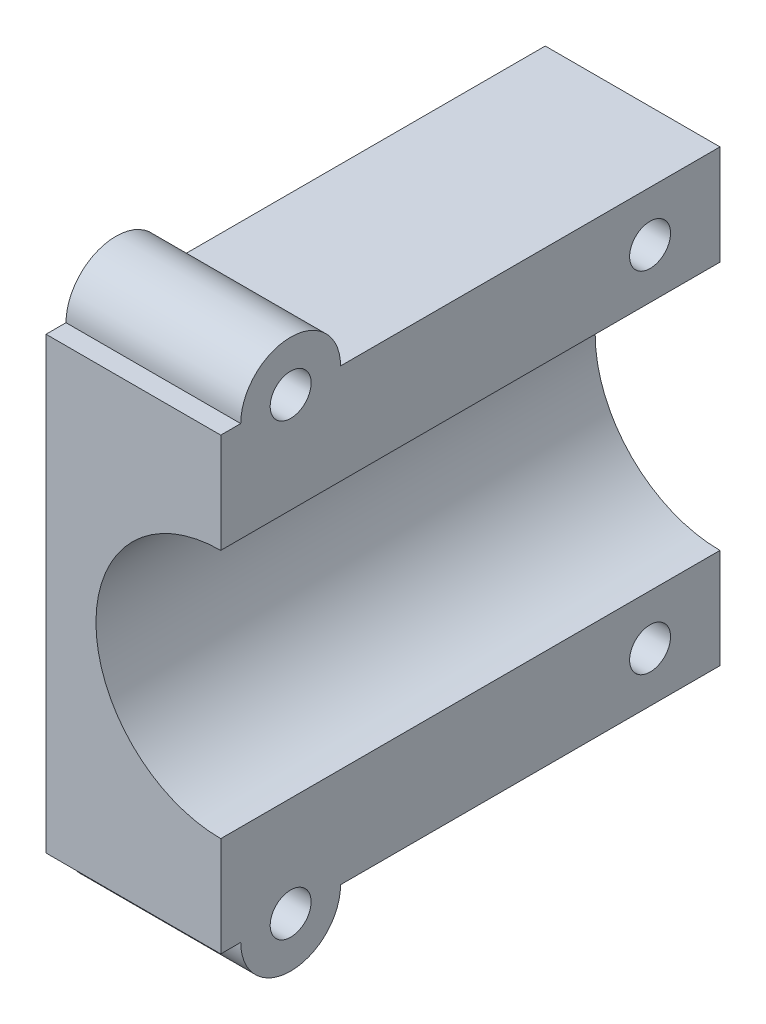
ISO-10303-21;
HEADER;
FILE_DESCRIPTION(('STEP AP214'),'2;1');
FILE_NAME('part.step','',(''),(''),'','','');
FILE_SCHEMA(('AUTOMOTIVE_DESIGN { 1 0 10303 214 1 1 1 1 }'));
ENDSEC;
DATA;
#1=APPLICATION_CONTEXT('core data for automotive mechanical design processes');
#2=APPLICATION_PROTOCOL_DEFINITION('international standard','automotive_design',2000,#1);
#3=PRODUCT_CONTEXT('',#1,'mechanical');
#4=PRODUCT('Part','Part','',(#3));
#5=PRODUCT_RELATED_PRODUCT_CATEGORY('part','',(#4));
#6=PRODUCT_DEFINITION_FORMATION('','',#4);
#7=PRODUCT_DEFINITION_CONTEXT('part definition',#1,'design');
#8=PRODUCT_DEFINITION('design','',#6,#7);
#9=PRODUCT_DEFINITION_SHAPE('','',#8);
#10=(LENGTH_UNIT() NAMED_UNIT(*) SI_UNIT(.MILLI.,.METRE.));
#11=(NAMED_UNIT(*) PLANE_ANGLE_UNIT() SI_UNIT($,.RADIAN.));
#12=(NAMED_UNIT(*) SI_UNIT($,.STERADIAN.) SOLID_ANGLE_UNIT());
#13=UNCERTAINTY_MEASURE_WITH_UNIT(LENGTH_MEASURE(1.E-05),#10,'distance_accuracy_value','');
#14=(GEOMETRIC_REPRESENTATION_CONTEXT(3) GLOBAL_UNCERTAINTY_ASSIGNED_CONTEXT((#13)) GLOBAL_UNIT_ASSIGNED_CONTEXT((#10,
#11,#12)) REPRESENTATION_CONTEXT('',''));
#15=CARTESIAN_POINT('',(0.,0.,0.));
#16=DIRECTION('',(0.,0.,1.));
#17=DIRECTION('',(1.,0.,0.));
#18=AXIS2_PLACEMENT_3D('',#15,#16,#17);
#19=CARTESIAN_POINT('',(23.2982756057297,40.,-18.));
#20=DIRECTION('',(-1.,0.,0.));
#21=DIRECTION('',(0.,0.,1.));
#22=AXIS2_PLACEMENT_3D('',#19,#20,#21);
#23=CYLINDRICAL_SURFACE('',#22,2.05);
#24=CARTESIAN_POINT('',(-17.5,40.,-18.));
#25=DIRECTION('',(1.,0.,0.));
#26=DIRECTION('',(0.,0.,1.));
#27=AXIS2_PLACEMENT_3D('',#24,#25,#26);
#28=CIRCLE('',#27,2.05);
#29=CARTESIAN_POINT('',(-17.5,40.,-15.95));
#30=VERTEX_POINT('',#29);
#31=EDGE_CURVE('E344',#30,#30,#28,.T.);
#32=ORIENTED_EDGE('',*,*,#31,.F.);
#33=EDGE_LOOP('',(#32));
#34=FACE_BOUND('',#33,.T.);
#35=CARTESIAN_POINT('',(-10.65,40.,-18.));
#36=DIRECTION('',(1.,0.,0.));
#37=DIRECTION('',(0.,0.,-1.));
#38=AXIS2_PLACEMENT_3D('',#35,#36,#37);
#39=CIRCLE('',#38,2.05);
#40=CARTESIAN_POINT('',(-10.65,40.,-20.05));
#41=VERTEX_POINT('',#40);
#42=EDGE_CURVE('E39',#41,#41,#39,.T.);
#43=ORIENTED_EDGE('',*,*,#42,.T.);
#44=EDGE_LOOP('',(#43));
#45=FACE_BOUND('',#44,.T.);
#46=ADVANCED_FACE('F35',(#34,#45),#23,.F.);
#47=CARTESIAN_POINT('',(5.79827560572969,0.,18.));
#48=DIRECTION('',(-1.,0.,0.));
#49=DIRECTION('',(0.,-1.,0.));
#50=AXIS2_PLACEMENT_3D('',#47,#48,#49);
#51=CYLINDRICAL_SURFACE('',#50,2.05);
#52=CARTESIAN_POINT('',(-17.5,0.,18.));
#53=DIRECTION('',(-1.,0.,0.));
#54=DIRECTION('',(0.,-1.,0.));
#55=AXIS2_PLACEMENT_3D('',#52,#53,#54);
#56=CIRCLE('',#55,2.05);
#57=CARTESIAN_POINT('',(-17.5,-2.05,18.));
#58=VERTEX_POINT('',#57);
#59=EDGE_CURVE('E305',#58,#58,#56,.T.);
#60=ORIENTED_EDGE('',*,*,#59,.T.);
#61=EDGE_LOOP('',(#60));
#62=FACE_BOUND('',#61,.T.);
#63=CARTESIAN_POINT('',(-10.65,0.,18.));
#64=DIRECTION('',(1.,0.,0.));
#65=DIRECTION('',(0.,0.,-1.));
#66=AXIS2_PLACEMENT_3D('',#63,#64,#65);
#67=CIRCLE('',#66,2.05);
#68=CARTESIAN_POINT('',(-10.65,0.,15.95));
#69=VERTEX_POINT('',#68);
#70=EDGE_CURVE('E381',#69,#69,#67,.F.);
#71=ORIENTED_EDGE('',*,*,#70,.F.);
#72=EDGE_LOOP('',(#71));
#73=FACE_BOUND('',#72,.T.);
#74=ADVANCED_FACE('F402',(#62,#73),#51,.F.);
#75=CARTESIAN_POINT('',(-17.5,45.,25.));
#76=DIRECTION('',(0.,1.,0.));
#77=DIRECTION('',(0.,0.,1.));
#78=AXIS2_PLACEMENT_3D('',#75,#76,#77);
#79=PLANE('',#78);
#80=DIRECTION('',(0.,0.,-1.));
#81=VECTOR('',#80,1.);
#82=CARTESIAN_POINT('',(-17.5,45.,25.));
#83=LINE('',#82,#81);
#84=CARTESIAN_POINT('',(-17.5,45.,13.));
#85=VERTEX_POINT('',#84);
#86=CARTESIAN_POINT('',(-17.5,45.,-25.));
#87=VERTEX_POINT('',#86);
#88=EDGE_CURVE('E351',#85,#87,#83,.T.);
#89=ORIENTED_EDGE('',*,*,#88,.F.);
#90=DIRECTION('',(-1.,0.,0.));
#91=VECTOR('',#90,1.);
#92=CARTESIAN_POINT('',(0.,45.,13.));
#93=LINE('',#92,#91);
#94=CARTESIAN_POINT('',(0.,45.,13.));
#95=VERTEX_POINT('',#94);
#96=EDGE_CURVE('E302',#95,#85,#93,.T.);
#97=ORIENTED_EDGE('',*,*,#96,.F.);
#98=DIRECTION('',(0.,0.,1.));
#99=VECTOR('',#98,1.);
#100=CARTESIAN_POINT('',(0.,45.,-25.));
#101=LINE('',#100,#99);
#102=CARTESIAN_POINT('',(0.,45.,-25.));
#103=VERTEX_POINT('',#102);
#104=EDGE_CURVE('E326',#103,#95,#101,.T.);
#105=ORIENTED_EDGE('',*,*,#104,.F.);
#106=DIRECTION('',(1.,0.,0.));
#107=VECTOR('',#106,1.);
#108=CARTESIAN_POINT('',(-17.5,45.,-25.));
#109=LINE('',#108,#107);
#110=EDGE_CURVE('E347',#87,#103,#109,.T.);
#111=ORIENTED_EDGE('',*,*,#110,.F.);
#112=EDGE_LOOP('',(#89,#97,#105,#111));
#113=FACE_BOUND('',#112,.T.);
#114=ADVANCED_FACE('F410',(#113),#79,.T.);
#115=CARTESIAN_POINT('',(0.,45.,23.));
#116=VERTEX_POINT('',#115);
#117=CARTESIAN_POINT('',(0.,45.,25.));
#118=VERTEX_POINT('',#117);
#119=EDGE_CURVE('E329',#116,#118,#101,.T.);
#120=ORIENTED_EDGE('',*,*,#119,.F.);
#121=DIRECTION('',(-1.,0.,0.));
#122=VECTOR('',#121,1.);
#123=CARTESIAN_POINT('',(0.,45.,23.));
#124=LINE('',#123,#122);
#125=CARTESIAN_POINT('',(-17.5,45.,23.));
#126=VERTEX_POINT('',#125);
#127=EDGE_CURVE('E52',#116,#126,#124,.T.);
#128=ORIENTED_EDGE('',*,*,#127,.T.);
#129=CARTESIAN_POINT('',(-17.5,45.,25.));
#130=VERTEX_POINT('',#129);
#131=EDGE_CURVE('E354',#130,#126,#83,.T.);
#132=ORIENTED_EDGE('',*,*,#131,.F.);
#133=DIRECTION('',(1.,0.,0.));
#134=VECTOR('',#133,1.);
#135=CARTESIAN_POINT('',(-17.5,45.,25.));
#136=LINE('',#135,#134);
#137=EDGE_CURVE('E348',#130,#118,#136,.T.);
#138=ORIENTED_EDGE('',*,*,#137,.T.);
#139=EDGE_LOOP('',(#120,#128,#132,#138));
#140=FACE_BOUND('',#139,.T.);
#141=ADVANCED_FACE('F453',(#140),#79,.T.);
#142=CARTESIAN_POINT('',(-17.5,0.,25.));
#143=DIRECTION('',(0.,1.,0.));
#144=DIRECTION('',(0.,0.,1.));
#145=AXIS2_PLACEMENT_3D('',#142,#143,#144);
#146=PLANE('',#145);
#147=DIRECTION('',(0.,0.,-1.));
#148=VECTOR('',#147,1.);
#149=CARTESIAN_POINT('',(0.,0.,-25.));
#150=LINE('',#149,#148);
#151=CARTESIAN_POINT('',(0.,0.,13.));
#152=VERTEX_POINT('',#151);
#153=CARTESIAN_POINT('',(0.,0.,-25.));
#154=VERTEX_POINT('',#153);
#155=EDGE_CURVE('E325',#152,#154,#150,.T.);
#156=ORIENTED_EDGE('',*,*,#155,.F.);
#157=DIRECTION('',(-1.,0.,0.));
#158=VECTOR('',#157,1.);
#159=CARTESIAN_POINT('',(0.,0.,13.));
#160=LINE('',#159,#158);
#161=CARTESIAN_POINT('',(-17.5,0.,13.));
#162=VERTEX_POINT('',#161);
#163=EDGE_CURVE('E317',#152,#162,#160,.T.);
#164=ORIENTED_EDGE('',*,*,#163,.T.);
#165=DIRECTION('',(0.,0.,-1.));
#166=VECTOR('',#165,1.);
#167=CARTESIAN_POINT('',(-17.5,0.,25.));
#168=LINE('',#167,#166);
#169=CARTESIAN_POINT('',(-17.5,0.,-25.));
#170=VERTEX_POINT('',#169);
#171=EDGE_CURVE('E44',#162,#170,#168,.T.);
#172=ORIENTED_EDGE('',*,*,#171,.T.);
#173=DIRECTION('',(1.,0.,0.));
#174=VECTOR('',#173,1.);
#175=CARTESIAN_POINT('',(-17.5,0.,-25.));
#176=LINE('',#175,#174);
#177=EDGE_CURVE('E372',#170,#154,#176,.T.);
#178=ORIENTED_EDGE('',*,*,#177,.T.);
#179=EDGE_LOOP('',(#156,#164,#172,#178));
#180=FACE_BOUND('',#179,.T.);
#181=ADVANCED_FACE('F464',(#180),#146,.F.);
#182=CARTESIAN_POINT('',(-17.5,22.5,25.));
#183=DIRECTION('',(1.,0.,0.));
#184=DIRECTION('',(0.,0.,-1.));
#185=AXIS2_PLACEMENT_3D('',#182,#183,#184);
#186=PLANE('',#185);
#187=CARTESIAN_POINT('',(-17.5,45.,18.));
#188=DIRECTION('',(1.,0.,0.));
#189=DIRECTION('',(0.,1.,0.));
#190=AXIS2_PLACEMENT_3D('',#187,#188,#189);
#191=CIRCLE('',#190,2.05);
#192=CARTESIAN_POINT('',(-17.5,47.05,18.));
#193=VERTEX_POINT('',#192);
#194=EDGE_CURVE('E293',#193,#193,#191,.T.);
#195=ORIENTED_EDGE('',*,*,#194,.T.);
#196=EDGE_LOOP('',(#195));
#197=FACE_BOUND('',#196,.T.);
#198=ORIENTED_EDGE('',*,*,#59,.F.);
#199=EDGE_LOOP('',(#198));
#200=FACE_BOUND('',#199,.T.);
#201=ORIENTED_EDGE('',*,*,#31,.T.);
#202=EDGE_LOOP('',(#201));
#203=FACE_BOUND('',#202,.T.);
#204=CARTESIAN_POINT('',(-17.5,5.,-18.));
#205=DIRECTION('',(-1.,0.,0.));
#206=DIRECTION('',(0.,0.,1.));
#207=AXIS2_PLACEMENT_3D('',#204,#205,#206);
#208=CIRCLE('',#207,2.05);
#209=CARTESIAN_POINT('',(-17.5,5.,-15.95));
#210=VERTEX_POINT('',#209);
#211=EDGE_CURVE('E357',#210,#210,#208,.T.);
#212=ORIENTED_EDGE('',*,*,#211,.F.);
#213=EDGE_LOOP('',(#212));
#214=FACE_BOUND('',#213,.T.);
#215=DIRECTION('',(0.,-1.,0.));
#216=VECTOR('',#215,1.);
#217=CARTESIAN_POINT('',(-17.5,22.5,-25.));
#218=LINE('',#217,#216);
#219=EDGE_CURVE('E360',#87,#170,#218,.T.);
#220=ORIENTED_EDGE('',*,*,#219,.T.);
#221=ORIENTED_EDGE('',*,*,#171,.F.);
#222=CARTESIAN_POINT('',(-17.5,0.,18.));
#223=DIRECTION('',(-1.,0.,0.));
#224=DIRECTION('',(0.,-1.,0.));
#225=AXIS2_PLACEMENT_3D('',#222,#223,#224);
#226=CIRCLE('',#225,5.);
#227=CARTESIAN_POINT('',(-17.5,0.,23.));
#228=VERTEX_POINT('',#227);
#229=EDGE_CURVE('E312',#162,#228,#226,.T.);
#230=ORIENTED_EDGE('',*,*,#229,.T.);
#231=CARTESIAN_POINT('',(-17.5,0.,25.));
#232=VERTEX_POINT('',#231);
#233=EDGE_CURVE('E11',#232,#228,#168,.T.);
#234=ORIENTED_EDGE('',*,*,#233,.F.);
#235=DIRECTION('',(0.,-1.,0.));
#236=VECTOR('',#235,1.);
#237=CARTESIAN_POINT('',(-17.5,22.5,25.));
#238=LINE('',#237,#236);
#239=EDGE_CURVE('E361',#130,#232,#238,.T.);
#240=ORIENTED_EDGE('',*,*,#239,.F.);
#241=ORIENTED_EDGE('',*,*,#131,.T.);
#242=CARTESIAN_POINT('',(-17.5,45.,18.));
#243=DIRECTION('',(1.,0.,0.));
#244=DIRECTION('',(0.,1.,0.));
#245=AXIS2_PLACEMENT_3D('',#242,#243,#244);
#246=CIRCLE('',#245,5.);
#247=EDGE_CURVE('E299',#85,#126,#246,.T.);
#248=ORIENTED_EDGE('',*,*,#247,.F.);
#249=ORIENTED_EDGE('',*,*,#88,.T.);
#250=EDGE_LOOP('',(#220,#221,#230,#234,#240,#241,#248,#249));
#251=FACE_BOUND('',#250,.T.);
#252=ADVANCED_FACE('F37',(#197,#200,#203,#214,#251),#186,.F.);
#253=ORIENTED_EDGE('',*,*,#233,.T.);
#254=DIRECTION('',(-1.,0.,0.));
#255=VECTOR('',#254,1.);
#256=CARTESIAN_POINT('',(0.,0.,23.));
#257=LINE('',#256,#255);
#258=CARTESIAN_POINT('',(0.,0.,23.));
#259=VERTEX_POINT('',#258);
#260=EDGE_CURVE('E314',#259,#228,#257,.T.);
#261=ORIENTED_EDGE('',*,*,#260,.F.);
#262=CARTESIAN_POINT('',(0.,0.,25.));
#263=VERTEX_POINT('',#262);
#264=EDGE_CURVE('E322',#263,#259,#150,.T.);
#265=ORIENTED_EDGE('',*,*,#264,.F.);
#266=DIRECTION('',(1.,0.,0.));
#267=VECTOR('',#266,1.);
#268=CARTESIAN_POINT('',(-17.5,0.,25.));
#269=LINE('',#268,#267);
#270=EDGE_CURVE('E363',#232,#263,#269,.T.);
#271=ORIENTED_EDGE('',*,*,#270,.F.);
#272=EDGE_LOOP('',(#253,#261,#265,#271));
#273=FACE_BOUND('',#272,.T.);
#274=ADVANCED_FACE('F471',(#273),#146,.F.);
#275=CARTESIAN_POINT('',(0.,22.5,25.));
#276=DIRECTION('',(0.,0.,-1.));
#277=DIRECTION('',(-1.,0.,0.));
#278=AXIS2_PLACEMENT_3D('',#275,#276,#277);
#279=CYLINDRICAL_SURFACE('',#278,12.5);
#280=CARTESIAN_POINT('',(0.,22.5,-25.));
#281=DIRECTION('',(0.,0.,-1.));
#282=DIRECTION('',(1.,0.,0.));
#283=AXIS2_PLACEMENT_3D('',#280,#281,#282);
#284=CIRCLE('',#283,12.5);
#285=CARTESIAN_POINT('',(0.,10.,-25.));
#286=VERTEX_POINT('',#285);
#287=CARTESIAN_POINT('',(0.,35.,-25.));
#288=VERTEX_POINT('',#287);
#289=EDGE_CURVE('E364',#286,#288,#284,.T.);
#290=ORIENTED_EDGE('',*,*,#289,.T.);
#291=DIRECTION('',(0.,0.,-1.));
#292=VECTOR('',#291,1.);
#293=CARTESIAN_POINT('',(0.,35.,25.));
#294=LINE('',#293,#292);
#295=CARTESIAN_POINT('',(0.,35.,25.));
#296=VERTEX_POINT('',#295);
#297=EDGE_CURVE('E341',#288,#296,#294,.F.);
#298=ORIENTED_EDGE('',*,*,#297,.T.);
#299=CARTESIAN_POINT('',(0.,22.5,25.));
#300=DIRECTION('',(0.,0.,-1.));
#301=DIRECTION('',(1.,0.,0.));
#302=AXIS2_PLACEMENT_3D('',#299,#300,#301);
#303=CIRCLE('',#302,12.5);
#304=CARTESIAN_POINT('',(0.,10.,25.));
#305=VERTEX_POINT('',#304);
#306=EDGE_CURVE('E367',#305,#296,#303,.T.);
#307=ORIENTED_EDGE('',*,*,#306,.F.);
#308=DIRECTION('',(0.,0.,-1.));
#309=VECTOR('',#308,1.);
#310=CARTESIAN_POINT('',(0.,10.,25.));
#311=LINE('',#310,#309);
#312=EDGE_CURVE('E337',#305,#286,#311,.T.);
#313=ORIENTED_EDGE('',*,*,#312,.T.);
#314=EDGE_LOOP('',(#290,#298,#307,#313));
#315=FACE_BOUND('',#314,.T.);
#316=ADVANCED_FACE('F461',(#315),#279,.F.);
#317=CARTESIAN_POINT('',(0.,22.5,25.));
#318=DIRECTION('',(0.,0.,1.));
#319=DIRECTION('',(1.,0.,0.));
#320=AXIS2_PLACEMENT_3D('',#317,#318,#319);
#321=PLANE('',#320);
#322=DIRECTION('',(0.,-1.,0.));
#323=VECTOR('',#322,1.);
#324=CARTESIAN_POINT('',(0.,22.5,25.));
#325=LINE('',#324,#323);
#326=EDGE_CURVE('E338',#118,#296,#325,.T.);
#327=ORIENTED_EDGE('',*,*,#326,.F.);
#328=ORIENTED_EDGE('',*,*,#137,.F.);
#329=ORIENTED_EDGE('',*,*,#239,.T.);
#330=ORIENTED_EDGE('',*,*,#270,.T.);
#331=EDGE_CURVE('E335',#305,#263,#325,.T.);
#332=ORIENTED_EDGE('',*,*,#331,.F.);
#333=ORIENTED_EDGE('',*,*,#306,.T.);
#334=EDGE_LOOP('',(#327,#328,#329,#330,#332,#333));
#335=FACE_BOUND('',#334,.T.);
#336=ADVANCED_FACE('F457',(#335),#321,.T.);
#337=CARTESIAN_POINT('',(0.,22.5,-25.));
#338=DIRECTION('',(0.,0.,1.));
#339=DIRECTION('',(1.,0.,0.));
#340=AXIS2_PLACEMENT_3D('',#337,#338,#339);
#341=PLANE('',#340);
#342=ORIENTED_EDGE('',*,*,#110,.T.);
#343=DIRECTION('',(0.,1.,0.));
#344=VECTOR('',#343,1.);
#345=CARTESIAN_POINT('',(0.,45.,-25.));
#346=LINE('',#345,#344);
#347=EDGE_CURVE('E320',#288,#103,#346,.T.);
#348=ORIENTED_EDGE('',*,*,#347,.F.);
#349=ORIENTED_EDGE('',*,*,#289,.F.);
#350=EDGE_CURVE('E330',#154,#286,#346,.T.);
#351=ORIENTED_EDGE('',*,*,#350,.F.);
#352=ORIENTED_EDGE('',*,*,#177,.F.);
#353=ORIENTED_EDGE('',*,*,#219,.F.);
#354=EDGE_LOOP('',(#342,#348,#349,#351,#352,#353));
#355=FACE_BOUND('',#354,.T.);
#356=ADVANCED_FACE('F428',(#355),#341,.F.);
#357=CARTESIAN_POINT('',(23.2982756057297,5.,-18.));
#358=DIRECTION('',(-1.,0.,0.));
#359=DIRECTION('',(0.,0.,1.));
#360=AXIS2_PLACEMENT_3D('',#357,#358,#359);
#361=CYLINDRICAL_SURFACE('',#360,2.05);
#362=CARTESIAN_POINT('',(0.,5.,-18.));
#363=DIRECTION('',(-1.,0.,0.));
#364=DIRECTION('',(0.,0.,1.));
#365=AXIS2_PLACEMENT_3D('',#362,#363,#364);
#366=CIRCLE('',#365,2.05);
#367=CARTESIAN_POINT('',(0.,5.,-15.95));
#368=VERTEX_POINT('',#367);
#369=EDGE_CURVE('E332',#368,#368,#366,.F.);
#370=ORIENTED_EDGE('',*,*,#369,.T.);
#371=EDGE_LOOP('',(#370));
#372=FACE_BOUND('',#371,.T.);
#373=ORIENTED_EDGE('',*,*,#211,.T.);
#374=EDGE_LOOP('',(#373));
#375=FACE_BOUND('',#374,.T.);
#376=ADVANCED_FACE('F419',(#372,#375),#361,.F.);
#377=CARTESIAN_POINT('',(-7.35,40.,-18.));
#378=DIRECTION('',(1.,0.,0.));
#379=DIRECTION('',(0.,0.,-1.));
#380=AXIS2_PLACEMENT_3D('',#377,#378,#379);
#381=CIRCLE('',#380,2.05);
#382=CARTESIAN_POINT('',(-7.35,40.,-20.05));
#383=VERTEX_POINT('',#382);
#384=EDGE_CURVE('E383',#383,#383,#381,.T.);
#385=ORIENTED_EDGE('',*,*,#384,.F.);
#386=EDGE_LOOP('',(#385));
#387=FACE_BOUND('',#386,.T.);
#388=CARTESIAN_POINT('',(0.,40.,-18.));
#389=DIRECTION('',(-1.,0.,0.));
#390=DIRECTION('',(0.,0.,1.));
#391=AXIS2_PLACEMENT_3D('',#388,#389,#390);
#392=CIRCLE('',#391,2.05);
#393=CARTESIAN_POINT('',(0.,40.,-15.95));
#394=VERTEX_POINT('',#393);
#395=EDGE_CURVE('E324',#394,#394,#392,.T.);
#396=ORIENTED_EDGE('',*,*,#395,.F.);
#397=EDGE_LOOP('',(#396));
#398=FACE_BOUND('',#397,.T.);
#399=ADVANCED_FACE('F405',(#387,#398),#23,.F.);
#400=CARTESIAN_POINT('',(0.,0.,0.));
#401=DIRECTION('',(-1.,0.,0.));
#402=DIRECTION('',(0.,0.,1.));
#403=AXIS2_PLACEMENT_3D('',#400,#401,#402);
#404=PLANE('',#403);
#405=CARTESIAN_POINT('',(0.,45.,18.));
#406=DIRECTION('',(-1.,0.,0.));
#407=DIRECTION('',(0.,0.,1.));
#408=AXIS2_PLACEMENT_3D('',#405,#406,#407);
#409=CIRCLE('',#408,2.05);
#410=CARTESIAN_POINT('',(0.,45.,20.05));
#411=VERTEX_POINT('',#410);
#412=EDGE_CURVE('E296',#411,#411,#409,.T.);
#413=ORIENTED_EDGE('',*,*,#412,.T.);
#414=EDGE_LOOP('',(#413));
#415=FACE_BOUND('',#414,.T.);
#416=ORIENTED_EDGE('',*,*,#395,.T.);
#417=EDGE_LOOP('',(#416));
#418=FACE_BOUND('',#417,.T.);
#419=ORIENTED_EDGE('',*,*,#347,.T.);
#420=ORIENTED_EDGE('',*,*,#104,.T.);
#421=CARTESIAN_POINT('',(0.,45.,18.));
#422=DIRECTION('',(1.,0.,0.));
#423=DIRECTION('',(0.,1.,0.));
#424=AXIS2_PLACEMENT_3D('',#421,#422,#423);
#425=CIRCLE('',#424,5.);
#426=EDGE_CURVE('E300',#95,#116,#425,.T.);
#427=ORIENTED_EDGE('',*,*,#426,.T.);
#428=ORIENTED_EDGE('',*,*,#119,.T.);
#429=ORIENTED_EDGE('',*,*,#326,.T.);
#430=ORIENTED_EDGE('',*,*,#297,.F.);
#431=EDGE_LOOP('',(#419,#420,#427,#428,#429,#430));
#432=FACE_BOUND('',#431,.T.);
#433=ADVANCED_FACE('F418',(#415,#418,#432),#404,.F.);
#434=CARTESIAN_POINT('',(0.,0.,18.));
#435=DIRECTION('',(-1.,0.,0.));
#436=DIRECTION('',(0.,0.,1.));
#437=AXIS2_PLACEMENT_3D('',#434,#435,#436);
#438=CIRCLE('',#437,2.05);
#439=CARTESIAN_POINT('',(0.,0.,20.05));
#440=VERTEX_POINT('',#439);
#441=EDGE_CURVE('E309',#440,#440,#438,.F.);
#442=ORIENTED_EDGE('',*,*,#441,.F.);
#443=EDGE_LOOP('',(#442));
#444=FACE_BOUND('',#443,.T.);
#445=ORIENTED_EDGE('',*,*,#369,.F.);
#446=EDGE_LOOP('',(#445));
#447=FACE_BOUND('',#446,.T.);
#448=ORIENTED_EDGE('',*,*,#331,.T.);
#449=ORIENTED_EDGE('',*,*,#264,.T.);
#450=CARTESIAN_POINT('',(0.,0.,18.));
#451=DIRECTION('',(-1.,0.,0.));
#452=DIRECTION('',(0.,-1.,0.));
#453=AXIS2_PLACEMENT_3D('',#450,#451,#452);
#454=CIRCLE('',#453,5.);
#455=EDGE_CURVE('E60',#152,#259,#454,.T.);
#456=ORIENTED_EDGE('',*,*,#455,.F.);
#457=ORIENTED_EDGE('',*,*,#155,.T.);
#458=ORIENTED_EDGE('',*,*,#350,.T.);
#459=ORIENTED_EDGE('',*,*,#312,.F.);
#460=EDGE_LOOP('',(#448,#449,#456,#457,#458,#459));
#461=FACE_BOUND('',#460,.T.);
#462=ADVANCED_FACE('F425',(#444,#447,#461),#404,.F.);
#463=CARTESIAN_POINT('',(0.,0.,18.));
#464=DIRECTION('',(-1.,0.,0.));
#465=DIRECTION('',(0.,-1.,0.));
#466=AXIS2_PLACEMENT_3D('',#463,#464,#465);
#467=CYLINDRICAL_SURFACE('',#466,5.);
#468=ORIENTED_EDGE('',*,*,#229,.F.);
#469=ORIENTED_EDGE('',*,*,#163,.F.);
#470=ORIENTED_EDGE('',*,*,#455,.T.);
#471=ORIENTED_EDGE('',*,*,#260,.T.);
#472=EDGE_LOOP('',(#468,#469,#470,#471));
#473=FACE_BOUND('',#472,.T.);
#474=ADVANCED_FACE('F466',(#473),#467,.T.);
#475=CARTESIAN_POINT('',(-7.35,0.,18.));
#476=DIRECTION('',(1.,0.,0.));
#477=DIRECTION('',(0.,0.,-1.));
#478=AXIS2_PLACEMENT_3D('',#475,#476,#477);
#479=CIRCLE('',#478,2.05);
#480=CARTESIAN_POINT('',(-7.35,0.,15.95));
#481=VERTEX_POINT('',#480);
#482=EDGE_CURVE('E238',#481,#481,#479,.F.);
#483=ORIENTED_EDGE('',*,*,#482,.T.);
#484=EDGE_LOOP('',(#483));
#485=FACE_BOUND('',#484,.T.);
#486=ORIENTED_EDGE('',*,*,#441,.T.);
#487=EDGE_LOOP('',(#486));
#488=FACE_BOUND('',#487,.T.);
#489=ADVANCED_FACE('F413',(#485,#488),#51,.F.);
#490=CARTESIAN_POINT('',(0.,45.,18.));
#491=DIRECTION('',(-1.,0.,0.));
#492=DIRECTION('',(0.,-1.,0.));
#493=AXIS2_PLACEMENT_3D('',#490,#491,#492);
#494=CYLINDRICAL_SURFACE('',#493,5.);
#495=ORIENTED_EDGE('',*,*,#247,.T.);
#496=ORIENTED_EDGE('',*,*,#127,.F.);
#497=ORIENTED_EDGE('',*,*,#426,.F.);
#498=ORIENTED_EDGE('',*,*,#96,.T.);
#499=EDGE_LOOP('',(#495,#496,#497,#498));
#500=FACE_BOUND('',#499,.T.);
#501=ADVANCED_FACE('F450',(#500),#494,.T.);
#502=CARTESIAN_POINT('',(5.79827560572969,45.,18.));
#503=DIRECTION('',(-1.,0.,0.));
#504=DIRECTION('',(0.,-1.,0.));
#505=AXIS2_PLACEMENT_3D('',#502,#503,#504);
#506=CYLINDRICAL_SURFACE('',#505,2.05);
#507=ORIENTED_EDGE('',*,*,#412,.F.);
#508=EDGE_LOOP('',(#507));
#509=FACE_BOUND('',#508,.T.);
#510=ORIENTED_EDGE('',*,*,#194,.F.);
#511=EDGE_LOOP('',(#510));
#512=FACE_BOUND('',#511,.T.);
#513=ADVANCED_FACE('F485',(#509,#512),#506,.F.);
#514=CARTESIAN_POINT('',(-10.65,0.,0.));
#515=DIRECTION('',(1.,0.,0.));
#516=DIRECTION('',(0.,0.,-1.));
#517=AXIS2_PLACEMENT_3D('',#514,#515,#516);
#518=PLANE('',#517);
#519=DIRECTION('',(0.,0.866025403784439,-0.5));
#520=VECTOR('',#519,1.);
#521=CARTESIAN_POINT('',(-10.65,-3.6,15.9215390309173));
#522=LINE('',#521,#520);
#523=CARTESIAN_POINT('',(-10.65,-3.6,15.9215390309173));
#524=VERTEX_POINT('',#523);
#525=CARTESIAN_POINT('',(-10.65,0.,13.8430780618347));
#526=VERTEX_POINT('',#525);
#527=EDGE_CURVE('E246',#524,#526,#522,.T.);
#528=ORIENTED_EDGE('',*,*,#527,.T.);
#529=DIRECTION('',(0.,0.866025403784438,0.5));
#530=VECTOR('',#529,1.);
#531=CARTESIAN_POINT('',(-10.65,0.,13.8430780618347));
#532=LINE('',#531,#530);
#533=CARTESIAN_POINT('',(-10.65,3.60000000000001,15.9215390309174));
#534=VERTEX_POINT('',#533);
#535=EDGE_CURVE('E249',#526,#534,#532,.T.);
#536=ORIENTED_EDGE('',*,*,#535,.T.);
#537=DIRECTION('',(0.,0.,1.));
#538=VECTOR('',#537,1.);
#539=CARTESIAN_POINT('',(-10.65,3.60000000000001,15.9215390309174));
#540=LINE('',#539,#538);
#541=CARTESIAN_POINT('',(-10.65,3.60000000000001,20.0784609690827));
#542=VERTEX_POINT('',#541);
#543=EDGE_CURVE('E253',#534,#542,#540,.T.);
#544=ORIENTED_EDGE('',*,*,#543,.T.);
#545=DIRECTION('',(0.,-0.866025403784439,0.5));
#546=VECTOR('',#545,1.);
#547=CARTESIAN_POINT('',(-10.65,3.60000000000001,20.0784609690827));
#548=LINE('',#547,#546);
#549=CARTESIAN_POINT('',(-10.65,0.,22.1569219381653));
#550=VERTEX_POINT('',#549);
#551=EDGE_CURVE('E256',#542,#550,#548,.T.);
#552=ORIENTED_EDGE('',*,*,#551,.T.);
#553=DIRECTION('',(0.,-0.866025403784438,-0.5));
#554=VECTOR('',#553,1.);
#555=CARTESIAN_POINT('',(-10.65,0.,22.1569219381653));
#556=LINE('',#555,#554);
#557=CARTESIAN_POINT('',(-10.65,-3.6,20.0784609690827));
#558=VERTEX_POINT('',#557);
#559=EDGE_CURVE('E259',#550,#558,#556,.T.);
#560=ORIENTED_EDGE('',*,*,#559,.T.);
#561=DIRECTION('',(0.,0.,-1.));
#562=VECTOR('',#561,1.);
#563=CARTESIAN_POINT('',(-10.65,-3.6,20.0784609690827));
#564=LINE('',#563,#562);
#565=EDGE_CURVE('E262',#558,#524,#564,.T.);
#566=ORIENTED_EDGE('',*,*,#565,.T.);
#567=EDGE_LOOP('',(#528,#536,#544,#552,#560,#566));
#568=FACE_BOUND('',#567,.T.);
#569=ORIENTED_EDGE('',*,*,#70,.T.);
#570=EDGE_LOOP('',(#569));
#571=FACE_BOUND('',#570,.T.);
#572=ADVANCED_FACE('F488',(#568,#571),#518,.T.);
#573=CARTESIAN_POINT('',(-7.35,0.,0.));
#574=DIRECTION('',(1.,0.,0.));
#575=DIRECTION('',(0.,0.,-1.));
#576=AXIS2_PLACEMENT_3D('',#573,#574,#575);
#577=PLANE('',#576);
#578=DIRECTION('',(0.,0.866025403784439,-0.5));
#579=VECTOR('',#578,1.);
#580=CARTESIAN_POINT('',(-7.35,-3.6,15.9215390309173));
#581=LINE('',#580,#579);
#582=CARTESIAN_POINT('',(-7.35,-3.6,15.9215390309173));
#583=VERTEX_POINT('',#582);
#584=CARTESIAN_POINT('',(-7.35,0.,13.8430780618347));
#585=VERTEX_POINT('',#584);
#586=EDGE_CURVE('E266',#583,#585,#581,.T.);
#587=ORIENTED_EDGE('',*,*,#586,.F.);
#588=DIRECTION('',(0.,0.,-1.));
#589=VECTOR('',#588,1.);
#590=CARTESIAN_POINT('',(-7.35,-3.6,20.0784609690827));
#591=LINE('',#590,#589);
#592=CARTESIAN_POINT('',(-7.35,-3.6,20.0784609690827));
#593=VERTEX_POINT('',#592);
#594=EDGE_CURVE('E250',#593,#583,#591,.T.);
#595=ORIENTED_EDGE('',*,*,#594,.F.);
#596=DIRECTION('',(0.,-0.866025403784438,-0.5));
#597=VECTOR('',#596,1.);
#598=CARTESIAN_POINT('',(-7.35,0.,22.1569219381653));
#599=LINE('',#598,#597);
#600=CARTESIAN_POINT('',(-7.35,0.,22.1569219381653));
#601=VERTEX_POINT('',#600);
#602=EDGE_CURVE('E278',#601,#593,#599,.T.);
#603=ORIENTED_EDGE('',*,*,#602,.F.);
#604=DIRECTION('',(0.,-0.866025403784439,0.5));
#605=VECTOR('',#604,1.);
#606=CARTESIAN_POINT('',(-7.35,3.60000000000001,20.0784609690827));
#607=LINE('',#606,#605);
#608=CARTESIAN_POINT('',(-7.35,3.60000000000001,20.0784609690827));
#609=VERTEX_POINT('',#608);
#610=EDGE_CURVE('E275',#609,#601,#607,.T.);
#611=ORIENTED_EDGE('',*,*,#610,.F.);
#612=DIRECTION('',(0.,0.,1.));
#613=VECTOR('',#612,1.);
#614=CARTESIAN_POINT('',(-7.35,3.60000000000001,15.9215390309174));
#615=LINE('',#614,#613);
#616=CARTESIAN_POINT('',(-7.35,3.60000000000001,15.9215390309174));
#617=VERTEX_POINT('',#616);
#618=EDGE_CURVE('E272',#617,#609,#615,.T.);
#619=ORIENTED_EDGE('',*,*,#618,.F.);
#620=DIRECTION('',(0.,0.866025403784438,0.5));
#621=VECTOR('',#620,1.);
#622=CARTESIAN_POINT('',(-7.35,0.,13.8430780618347));
#623=LINE('',#622,#621);
#624=EDGE_CURVE('E269',#585,#617,#623,.T.);
#625=ORIENTED_EDGE('',*,*,#624,.F.);
#626=EDGE_LOOP('',(#587,#595,#603,#611,#619,#625));
#627=FACE_BOUND('',#626,.T.);
#628=ORIENTED_EDGE('',*,*,#482,.F.);
#629=EDGE_LOOP('',(#628));
#630=FACE_BOUND('',#629,.T.);
#631=ADVANCED_FACE('F494',(#627,#630),#577,.F.);
#632=CARTESIAN_POINT('',(-10.65,-3.6,15.9215390309173));
#633=DIRECTION('',(0.,-0.5,-0.866025403784439));
#634=DIRECTION('',(0.,0.866025403784439,-0.5));
#635=AXIS2_PLACEMENT_3D('',#632,#633,#634);
#636=PLANE('',#635);
#637=ORIENTED_EDGE('',*,*,#586,.T.);
#638=DIRECTION('',(1.,0.,0.));
#639=VECTOR('',#638,1.);
#640=CARTESIAN_POINT('',(-10.65,0.,13.8430780618347));
#641=LINE('',#640,#639);
#642=EDGE_CURVE('E265',#526,#585,#641,.T.);
#643=ORIENTED_EDGE('',*,*,#642,.F.);
#644=ORIENTED_EDGE('',*,*,#527,.F.);
#645=DIRECTION('',(1.,0.,0.));
#646=VECTOR('',#645,1.);
#647=CARTESIAN_POINT('',(-10.65,-3.6,15.9215390309173));
#648=LINE('',#647,#646);
#649=EDGE_CURVE('E226',#524,#583,#648,.T.);
#650=ORIENTED_EDGE('',*,*,#649,.T.);
#651=EDGE_LOOP('',(#637,#643,#644,#650));
#652=FACE_BOUND('',#651,.T.);
#653=ADVANCED_FACE('F490',(#652),#636,.F.);
#654=CARTESIAN_POINT('',(-10.65,-3.6,20.0784609690827));
#655=DIRECTION('',(0.,-1.,0.));
#656=DIRECTION('',(0.,0.,-1.));
#657=AXIS2_PLACEMENT_3D('',#654,#655,#656);
#658=PLANE('',#657);
#659=ORIENTED_EDGE('',*,*,#594,.T.);
#660=ORIENTED_EDGE('',*,*,#649,.F.);
#661=ORIENTED_EDGE('',*,*,#565,.F.);
#662=DIRECTION('',(1.,0.,0.));
#663=VECTOR('',#662,1.);
#664=CARTESIAN_POINT('',(-10.65,-3.6,20.0784609690827));
#665=LINE('',#664,#663);
#666=EDGE_CURVE('E284',#558,#593,#665,.T.);
#667=ORIENTED_EDGE('',*,*,#666,.T.);
#668=EDGE_LOOP('',(#659,#660,#661,#667));
#669=FACE_BOUND('',#668,.T.);
#670=ADVANCED_FACE('F493',(#669),#658,.F.);
#671=CARTESIAN_POINT('',(-10.65,0.,22.1569219381653));
#672=DIRECTION('',(0.,-0.5,0.866025403784438));
#673=DIRECTION('',(0.,-0.866025403784439,-0.5));
#674=AXIS2_PLACEMENT_3D('',#671,#672,#673);
#675=PLANE('',#674);
#676=ORIENTED_EDGE('',*,*,#602,.T.);
#677=ORIENTED_EDGE('',*,*,#666,.F.);
#678=ORIENTED_EDGE('',*,*,#559,.F.);
#679=DIRECTION('',(1.,0.,0.));
#680=VECTOR('',#679,1.);
#681=CARTESIAN_POINT('',(-10.65,0.,22.1569219381653));
#682=LINE('',#681,#680);
#683=EDGE_CURVE('E286',#550,#601,#682,.T.);
#684=ORIENTED_EDGE('',*,*,#683,.T.);
#685=EDGE_LOOP('',(#676,#677,#678,#684));
#686=FACE_BOUND('',#685,.T.);
#687=ADVANCED_FACE('F507',(#686),#675,.F.);
#688=CARTESIAN_POINT('',(-10.65,3.60000000000001,20.0784609690827));
#689=DIRECTION('',(0.,0.5,0.866025403784439));
#690=DIRECTION('',(0.,-0.866025403784439,0.5));
#691=AXIS2_PLACEMENT_3D('',#688,#689,#690);
#692=PLANE('',#691);
#693=ORIENTED_EDGE('',*,*,#610,.T.);
#694=ORIENTED_EDGE('',*,*,#683,.F.);
#695=ORIENTED_EDGE('',*,*,#551,.F.);
#696=DIRECTION('',(1.,0.,0.));
#697=VECTOR('',#696,1.);
#698=CARTESIAN_POINT('',(-10.65,3.60000000000001,20.0784609690827));
#699=LINE('',#698,#697);
#700=EDGE_CURVE('E288',#542,#609,#699,.T.);
#701=ORIENTED_EDGE('',*,*,#700,.T.);
#702=EDGE_LOOP('',(#693,#694,#695,#701));
#703=FACE_BOUND('',#702,.T.);
#704=ADVANCED_FACE('F503',(#703),#692,.F.);
#705=CARTESIAN_POINT('',(-10.65,3.60000000000001,15.9215390309174));
#706=DIRECTION('',(0.,1.,0.));
#707=DIRECTION('',(0.,0.,1.));
#708=AXIS2_PLACEMENT_3D('',#705,#706,#707);
#709=PLANE('',#708);
#710=ORIENTED_EDGE('',*,*,#618,.T.);
#711=ORIENTED_EDGE('',*,*,#700,.F.);
#712=ORIENTED_EDGE('',*,*,#543,.F.);
#713=DIRECTION('',(1.,0.,0.));
#714=VECTOR('',#713,1.);
#715=CARTESIAN_POINT('',(-10.65,3.60000000000001,15.9215390309174));
#716=LINE('',#715,#714);
#717=EDGE_CURVE('E290',#534,#617,#716,.T.);
#718=ORIENTED_EDGE('',*,*,#717,.T.);
#719=EDGE_LOOP('',(#710,#711,#712,#718));
#720=FACE_BOUND('',#719,.T.);
#721=ADVANCED_FACE('F499',(#720),#709,.F.);
#722=CARTESIAN_POINT('',(-10.65,0.,13.8430780618347));
#723=DIRECTION('',(0.,0.500000000000001,-0.866025403784438));
#724=DIRECTION('',(0.,0.866025403784438,0.500000000000001));
#725=AXIS2_PLACEMENT_3D('',#722,#723,#724);
#726=PLANE('',#725);
#727=ORIENTED_EDGE('',*,*,#624,.T.);
#728=ORIENTED_EDGE('',*,*,#717,.F.);
#729=ORIENTED_EDGE('',*,*,#535,.F.);
#730=ORIENTED_EDGE('',*,*,#642,.T.);
#731=EDGE_LOOP('',(#727,#728,#729,#730));
#732=FACE_BOUND('',#731,.T.);
#733=ADVANCED_FACE('F496',(#732),#726,.F.);
#734=CARTESIAN_POINT('',(-10.65,36.4,-20.0784609690826));
#735=DIRECTION('',(0.,-0.5,-0.866025403784439));
#736=DIRECTION('',(0.,0.866025403784439,-0.5));
#737=AXIS2_PLACEMENT_3D('',#734,#735,#736);
#738=PLANE('',#737);
#739=DIRECTION('',(0.,0.866025403784439,-0.5));
#740=VECTOR('',#739,1.);
#741=CARTESIAN_POINT('',(-7.35,36.4,-20.0784609690826));
#742=LINE('',#741,#740);
#743=CARTESIAN_POINT('',(-7.35,36.4,-20.0784609690826));
#744=VERTEX_POINT('',#743);
#745=CARTESIAN_POINT('',(-7.35,40.,-22.1569219381653));
#746=VERTEX_POINT('',#745);
#747=EDGE_CURVE('E193',#744,#746,#742,.T.);
#748=ORIENTED_EDGE('',*,*,#747,.T.);
#749=DIRECTION('',(1.,0.,0.));
#750=VECTOR('',#749,1.);
#751=CARTESIAN_POINT('',(-10.65,40.,-22.1569219381653));
#752=LINE('',#751,#750);
#753=CARTESIAN_POINT('',(-10.65,40.,-22.1569219381653));
#754=VERTEX_POINT('',#753);
#755=EDGE_CURVE('E186',#754,#746,#752,.T.);
#756=ORIENTED_EDGE('',*,*,#755,.F.);
#757=DIRECTION('',(0.,0.866025403784439,-0.5));
#758=VECTOR('',#757,1.);
#759=CARTESIAN_POINT('',(-10.65,36.4,-20.0784609690826));
#760=LINE('',#759,#758);
#761=CARTESIAN_POINT('',(-10.65,36.4,-20.0784609690826));
#762=VERTEX_POINT('',#761);
#763=EDGE_CURVE('E190',#762,#754,#760,.T.);
#764=ORIENTED_EDGE('',*,*,#763,.F.);
#765=DIRECTION('',(1.,0.,0.));
#766=VECTOR('',#765,1.);
#767=CARTESIAN_POINT('',(-10.65,36.4,-20.0784609690826));
#768=LINE('',#767,#766);
#769=EDGE_CURVE('E236',#762,#744,#768,.T.);
#770=ORIENTED_EDGE('',*,*,#769,.T.);
#771=EDGE_LOOP('',(#748,#756,#764,#770));
#772=FACE_BOUND('',#771,.T.);
#773=ADVANCED_FACE('F188',(#772),#738,.F.);
#774=CARTESIAN_POINT('',(-10.65,36.4,-15.9215390309173));
#775=DIRECTION('',(0.,-1.,0.));
#776=DIRECTION('',(0.,0.,-1.));
#777=AXIS2_PLACEMENT_3D('',#774,#775,#776);
#778=PLANE('',#777);
#779=DIRECTION('',(0.,0.,-1.));
#780=VECTOR('',#779,1.);
#781=CARTESIAN_POINT('',(-7.35,36.4,-15.9215390309173));
#782=LINE('',#781,#780);
#783=CARTESIAN_POINT('',(-7.35,36.4,-15.9215390309173));
#784=VERTEX_POINT('',#783);
#785=EDGE_CURVE('E211',#784,#744,#782,.T.);
#786=ORIENTED_EDGE('',*,*,#785,.T.);
#787=ORIENTED_EDGE('',*,*,#769,.F.);
#788=DIRECTION('',(0.,0.,-1.));
#789=VECTOR('',#788,1.);
#790=CARTESIAN_POINT('',(-10.65,36.4,-15.9215390309173));
#791=LINE('',#790,#789);
#792=CARTESIAN_POINT('',(-10.65,36.4,-15.9215390309173));
#793=VERTEX_POINT('',#792);
#794=EDGE_CURVE('E198',#793,#762,#791,.T.);
#795=ORIENTED_EDGE('',*,*,#794,.F.);
#796=DIRECTION('',(1.,0.,0.));
#797=VECTOR('',#796,1.);
#798=CARTESIAN_POINT('',(-10.65,36.4,-15.9215390309173));
#799=LINE('',#798,#797);
#800=EDGE_CURVE('E239',#793,#784,#799,.T.);
#801=ORIENTED_EDGE('',*,*,#800,.T.);
#802=EDGE_LOOP('',(#786,#787,#795,#801));
#803=FACE_BOUND('',#802,.T.);
#804=ADVANCED_FACE('F522',(#803),#778,.F.);
#805=CARTESIAN_POINT('',(-10.65,40.,-13.8430780618347));
#806=DIRECTION('',(0.,-0.5,0.866025403784438));
#807=DIRECTION('',(0.,-0.866025403784438,-0.5));
#808=AXIS2_PLACEMENT_3D('',#805,#806,#807);
#809=PLANE('',#808);
#810=DIRECTION('',(0.,-0.866025403784438,-0.5));
#811=VECTOR('',#810,1.);
#812=CARTESIAN_POINT('',(-7.35,40.,-13.8430780618347));
#813=LINE('',#812,#811);
#814=CARTESIAN_POINT('',(-7.35,40.,-13.8430780618347));
#815=VERTEX_POINT('',#814);
#816=EDGE_CURVE('E214',#815,#784,#813,.T.);
#817=ORIENTED_EDGE('',*,*,#816,.T.);
#818=ORIENTED_EDGE('',*,*,#800,.F.);
#819=DIRECTION('',(0.,-0.866025403784438,-0.5));
#820=VECTOR('',#819,1.);
#821=CARTESIAN_POINT('',(-10.65,40.,-13.8430780618347));
#822=LINE('',#821,#820);
#823=CARTESIAN_POINT('',(-10.65,40.,-13.8430780618347));
#824=VERTEX_POINT('',#823);
#825=EDGE_CURVE('E221',#824,#793,#822,.T.);
#826=ORIENTED_EDGE('',*,*,#825,.F.);
#827=DIRECTION('',(1.,0.,0.));
#828=VECTOR('',#827,1.);
#829=CARTESIAN_POINT('',(-10.65,40.,-13.8430780618347));
#830=LINE('',#829,#828);
#831=EDGE_CURVE('E241',#824,#815,#830,.T.);
#832=ORIENTED_EDGE('',*,*,#831,.T.);
#833=EDGE_LOOP('',(#817,#818,#826,#832));
#834=FACE_BOUND('',#833,.T.);
#835=ADVANCED_FACE('F530',(#834),#809,.F.);
#836=CARTESIAN_POINT('',(-10.65,43.6,-15.9215390309173));
#837=DIRECTION('',(0.,0.5,0.866025403784439));
#838=DIRECTION('',(0.,-0.866025403784439,0.5));
#839=AXIS2_PLACEMENT_3D('',#836,#837,#838);
#840=PLANE('',#839);
#841=DIRECTION('',(0.,-0.866025403784439,0.5));
#842=VECTOR('',#841,1.);
#843=CARTESIAN_POINT('',(-7.35,43.6,-15.9215390309173));
#844=LINE('',#843,#842);
#845=CARTESIAN_POINT('',(-7.35,43.6,-15.9215390309173));
#846=VERTEX_POINT('',#845);
#847=EDGE_CURVE('E231',#846,#815,#844,.T.);
#848=ORIENTED_EDGE('',*,*,#847,.T.);
#849=ORIENTED_EDGE('',*,*,#831,.F.);
#850=DIRECTION('',(0.,-0.866025403784439,0.5));
#851=VECTOR('',#850,1.);
#852=CARTESIAN_POINT('',(-10.65,43.6,-15.9215390309173));
#853=LINE('',#852,#851);
#854=CARTESIAN_POINT('',(-10.65,43.6,-15.9215390309173));
#855=VERTEX_POINT('',#854);
#856=EDGE_CURVE('E218',#855,#824,#853,.T.);
#857=ORIENTED_EDGE('',*,*,#856,.F.);
#858=DIRECTION('',(1.,0.,0.));
#859=VECTOR('',#858,1.);
#860=CARTESIAN_POINT('',(-10.65,43.6,-15.9215390309173));
#861=LINE('',#860,#859);
#862=EDGE_CURVE('E243',#855,#846,#861,.T.);
#863=ORIENTED_EDGE('',*,*,#862,.T.);
#864=EDGE_LOOP('',(#848,#849,#857,#863));
#865=FACE_BOUND('',#864,.T.);
#866=ADVANCED_FACE('F526',(#865),#840,.F.);
#867=CARTESIAN_POINT('',(-10.65,43.6,-20.0784609690826));
#868=DIRECTION('',(0.,1.,0.));
#869=DIRECTION('',(0.,0.,1.));
#870=AXIS2_PLACEMENT_3D('',#867,#868,#869);
#871=PLANE('',#870);
#872=DIRECTION('',(0.,0.,1.));
#873=VECTOR('',#872,1.);
#874=CARTESIAN_POINT('',(-7.35,43.6,-20.0784609690826));
#875=LINE('',#874,#873);
#876=CARTESIAN_POINT('',(-7.35,43.6,-20.0784609690826));
#877=VERTEX_POINT('',#876);
#878=EDGE_CURVE('E228',#877,#846,#875,.T.);
#879=ORIENTED_EDGE('',*,*,#878,.T.);
#880=ORIENTED_EDGE('',*,*,#862,.F.);
#881=DIRECTION('',(0.,0.,1.));
#882=VECTOR('',#881,1.);
#883=CARTESIAN_POINT('',(-10.65,43.6,-20.0784609690826));
#884=LINE('',#883,#882);
#885=CARTESIAN_POINT('',(-10.65,43.6,-20.0784609690826));
#886=VERTEX_POINT('',#885);
#887=EDGE_CURVE('E206',#886,#855,#884,.T.);
#888=ORIENTED_EDGE('',*,*,#887,.F.);
#889=DIRECTION('',(1.,0.,0.));
#890=VECTOR('',#889,1.);
#891=CARTESIAN_POINT('',(-10.65,43.6,-20.0784609690826));
#892=LINE('',#891,#890);
#893=EDGE_CURVE('E197',#886,#877,#892,.T.);
#894=ORIENTED_EDGE('',*,*,#893,.T.);
#895=EDGE_LOOP('',(#879,#880,#888,#894));
#896=FACE_BOUND('',#895,.T.);
#897=ADVANCED_FACE('F399',(#896),#871,.F.);
#898=CARTESIAN_POINT('',(-10.65,40.,-22.1569219381653));
#899=DIRECTION('',(0.,0.500000000000001,-0.866025403784438));
#900=DIRECTION('',(0.,0.866025403784438,0.500000000000001));
#901=AXIS2_PLACEMENT_3D('',#898,#899,#900);
#902=PLANE('',#901);
#903=DIRECTION('',(0.,0.866025403784438,0.500000000000001));
#904=VECTOR('',#903,1.);
#905=CARTESIAN_POINT('',(-7.35,40.,-22.1569219381653));
#906=LINE('',#905,#904);
#907=EDGE_CURVE('E225',#746,#877,#906,.T.);
#908=ORIENTED_EDGE('',*,*,#907,.T.);
#909=ORIENTED_EDGE('',*,*,#893,.F.);
#910=DIRECTION('',(0.,0.866025403784438,0.500000000000001));
#911=VECTOR('',#910,1.);
#912=CARTESIAN_POINT('',(-10.65,40.,-22.1569219381653));
#913=LINE('',#912,#911);
#914=EDGE_CURVE('E201',#754,#886,#913,.T.);
#915=ORIENTED_EDGE('',*,*,#914,.F.);
#916=ORIENTED_EDGE('',*,*,#755,.T.);
#917=EDGE_LOOP('',(#908,#909,#915,#916));
#918=FACE_BOUND('',#917,.T.);
#919=ADVANCED_FACE('F202',(#918),#902,.F.);
#920=CARTESIAN_POINT('',(-10.65,0.,0.));
#921=DIRECTION('',(1.,0.,0.));
#922=DIRECTION('',(0.,0.,-1.));
#923=AXIS2_PLACEMENT_3D('',#920,#921,#922);
#924=PLANE('',#923);
#925=ORIENTED_EDGE('',*,*,#42,.F.);
#926=EDGE_LOOP('',(#925));
#927=FACE_BOUND('',#926,.T.);
#928=ORIENTED_EDGE('',*,*,#763,.T.);
#929=ORIENTED_EDGE('',*,*,#914,.T.);
#930=ORIENTED_EDGE('',*,*,#887,.T.);
#931=ORIENTED_EDGE('',*,*,#856,.T.);
#932=ORIENTED_EDGE('',*,*,#825,.T.);
#933=ORIENTED_EDGE('',*,*,#794,.T.);
#934=EDGE_LOOP('',(#928,#929,#930,#931,#932,#933));
#935=FACE_BOUND('',#934,.T.);
#936=ADVANCED_FACE('F208',(#927,#935),#924,.T.);
#937=CARTESIAN_POINT('',(-7.35,0.,0.));
#938=DIRECTION('',(1.,0.,0.));
#939=DIRECTION('',(0.,0.,-1.));
#940=AXIS2_PLACEMENT_3D('',#937,#938,#939);
#941=PLANE('',#940);
#942=ORIENTED_EDGE('',*,*,#384,.T.);
#943=EDGE_LOOP('',(#942));
#944=FACE_BOUND('',#943,.T.);
#945=ORIENTED_EDGE('',*,*,#747,.F.);
#946=ORIENTED_EDGE('',*,*,#785,.F.);
#947=ORIENTED_EDGE('',*,*,#816,.F.);
#948=ORIENTED_EDGE('',*,*,#847,.F.);
#949=ORIENTED_EDGE('',*,*,#878,.F.);
#950=ORIENTED_EDGE('',*,*,#907,.F.);
#951=EDGE_LOOP('',(#945,#946,#947,#948,#949,#950));
#952=FACE_BOUND('',#951,.T.);
#953=ADVANCED_FACE('F392',(#944,#952),#941,.F.);
#954=CLOSED_SHELL('',(#46,#74,#114,#141,#181,#252,#274,#316,#336,#356,#376,#399,#433,#462,#474,
#489,#501,#513,#572,#631,#653,#670,#687,#704,#721,#733,#773,#804,#835,#866,#897,#919,#936,#953));
#955=MANIFOLD_SOLID_BREP('B2',#954);
#956=ADVANCED_BREP_SHAPE_REPRESENTATION('',(#18,#955),#14);
#957=SHAPE_DEFINITION_REPRESENTATION(#9,#956);
ENDSEC;
END-ISO-10303-21;
